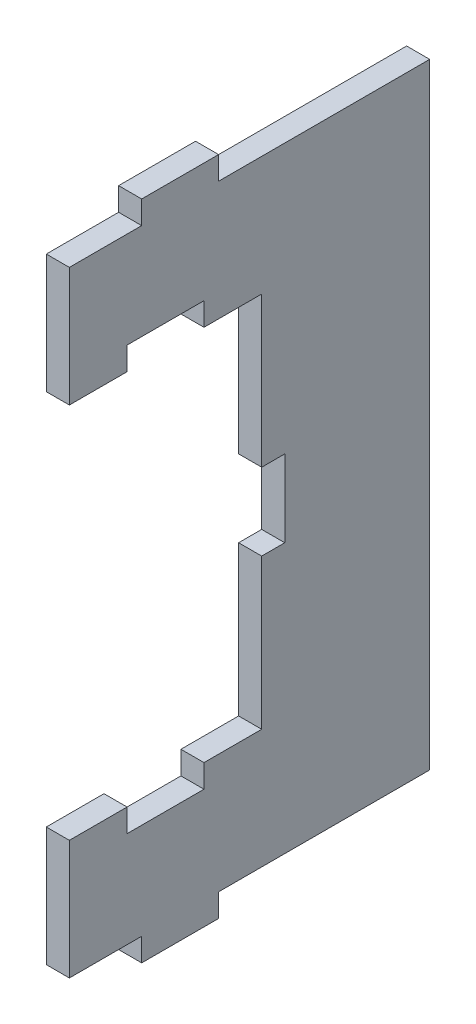
ISO-10303-21;
HEADER;
FILE_DESCRIPTION(('STEP AP214'),'2;1');
FILE_NAME('part.step','',(''),(''),'','','');
FILE_SCHEMA(('AUTOMOTIVE_DESIGN { 1 0 10303 214 1 1 1 1 }'));
ENDSEC;
DATA;
#1=APPLICATION_CONTEXT('core data for automotive mechanical design processes');
#2=APPLICATION_PROTOCOL_DEFINITION('international standard','automotive_design',2000,#1);
#3=PRODUCT_CONTEXT('',#1,'mechanical');
#4=PRODUCT('Part','Part','',(#3));
#5=PRODUCT_RELATED_PRODUCT_CATEGORY('part','',(#4));
#6=PRODUCT_DEFINITION_FORMATION('','',#4);
#7=PRODUCT_DEFINITION_CONTEXT('part definition',#1,'design');
#8=PRODUCT_DEFINITION('design','',#6,#7);
#9=PRODUCT_DEFINITION_SHAPE('','',#8);
#10=(LENGTH_UNIT() NAMED_UNIT(*) SI_UNIT(.MILLI.,.METRE.));
#11=(NAMED_UNIT(*) PLANE_ANGLE_UNIT() SI_UNIT($,.RADIAN.));
#12=(NAMED_UNIT(*) SI_UNIT($,.STERADIAN.) SOLID_ANGLE_UNIT());
#13=UNCERTAINTY_MEASURE_WITH_UNIT(LENGTH_MEASURE(1.E-05),#10,'distance_accuracy_value','');
#14=(GEOMETRIC_REPRESENTATION_CONTEXT(3) GLOBAL_UNCERTAINTY_ASSIGNED_CONTEXT((#13)) GLOBAL_UNIT_ASSIGNED_CONTEXT((#10,
#11,#12)) REPRESENTATION_CONTEXT('',''));
#15=CARTESIAN_POINT('',(0.,0.,0.));
#16=DIRECTION('',(0.,0.,1.));
#17=DIRECTION('',(1.,0.,0.));
#18=AXIS2_PLACEMENT_3D('',#15,#16,#17);
#19=CARTESIAN_POINT('',(3.,24.5,39.3399999999991));
#20=DIRECTION('',(0.,-1.,0.));
#21=DIRECTION('',(0.,0.,-1.));
#22=AXIS2_PLACEMENT_3D('',#19,#20,#21);
#23=PLANE('',#22);
#24=DIRECTION('',(0.,0.,1.));
#25=VECTOR('',#24,1.);
#26=CARTESIAN_POINT('',(0.,24.5,39.3399999999991));
#27=LINE('',#26,#25);
#28=CARTESIAN_POINT('',(0.,24.5,39.3399999999991));
#29=VERTEX_POINT('',#28);
#30=CARTESIAN_POINT('',(0.,24.5,46.84));
#31=VERTEX_POINT('',#30);
#32=EDGE_CURVE('E241',#29,#31,#27,.T.);
#33=ORIENTED_EDGE('',*,*,#32,.F.);
#34=DIRECTION('',(-1.,0.,0.));
#35=VECTOR('',#34,1.);
#36=CARTESIAN_POINT('',(3.,24.5,39.3399999999991));
#37=LINE('',#36,#35);
#38=CARTESIAN_POINT('',(3.,24.5,39.3399999999991));
#39=VERTEX_POINT('',#38);
#40=EDGE_CURVE('E32',#39,#29,#37,.T.);
#41=ORIENTED_EDGE('',*,*,#40,.F.);
#42=DIRECTION('',(0.,0.,1.));
#43=VECTOR('',#42,1.);
#44=CARTESIAN_POINT('',(3.,24.5,39.3399999999991));
#45=LINE('',#44,#43);
#46=CARTESIAN_POINT('',(3.,24.5,46.84));
#47=VERTEX_POINT('',#46);
#48=EDGE_CURVE('E232',#39,#47,#45,.T.);
#49=ORIENTED_EDGE('',*,*,#48,.T.);
#50=DIRECTION('',(-1.,0.,0.));
#51=VECTOR('',#50,1.);
#52=CARTESIAN_POINT('',(3.,24.5,46.84));
#53=LINE('',#52,#51);
#54=EDGE_CURVE('E10',#47,#31,#53,.T.);
#55=ORIENTED_EDGE('',*,*,#54,.T.);
#56=EDGE_LOOP('',(#33,#41,#49,#55));
#57=FACE_BOUND('',#56,.T.);
#58=ADVANCED_FACE('F16',(#57),#23,.T.);
#59=CARTESIAN_POINT('',(3.,24.5,46.84));
#60=DIRECTION('',(0.,0.,1.));
#61=DIRECTION('',(0.,-1.,0.));
#62=AXIS2_PLACEMENT_3D('',#59,#60,#61);
#63=PLANE('',#62);
#64=DIRECTION('',(0.,1.,0.));
#65=VECTOR('',#64,1.);
#66=CARTESIAN_POINT('',(0.,24.5,46.84));
#67=LINE('',#66,#65);
#68=CARTESIAN_POINT('',(0.,40.,46.84));
#69=VERTEX_POINT('',#68);
#70=EDGE_CURVE('E236',#31,#69,#67,.T.);
#71=ORIENTED_EDGE('',*,*,#70,.F.);
#72=ORIENTED_EDGE('',*,*,#54,.F.);
#73=DIRECTION('',(0.,1.,0.));
#74=VECTOR('',#73,1.);
#75=CARTESIAN_POINT('',(3.,24.5,46.84));
#76=LINE('',#75,#74);
#77=CARTESIAN_POINT('',(3.,40.,46.84));
#78=VERTEX_POINT('',#77);
#79=EDGE_CURVE('E234',#47,#78,#76,.T.);
#80=ORIENTED_EDGE('',*,*,#79,.T.);
#81=DIRECTION('',(-1.,0.,0.));
#82=VECTOR('',#81,1.);
#83=CARTESIAN_POINT('',(3.,40.,46.84));
#84=LINE('',#83,#82);
#85=EDGE_CURVE('E24',#78,#69,#84,.T.);
#86=ORIENTED_EDGE('',*,*,#85,.T.);
#87=EDGE_LOOP('',(#71,#72,#80,#86));
#88=FACE_BOUND('',#87,.T.);
#89=ADVANCED_FACE('F390',(#88),#63,.T.);
#90=CARTESIAN_POINT('',(3.,40.,46.84));
#91=DIRECTION('',(0.,1.,0.));
#92=DIRECTION('',(0.,0.,1.));
#93=AXIS2_PLACEMENT_3D('',#90,#91,#92);
#94=PLANE('',#93);
#95=DIRECTION('',(0.,0.,-1.));
#96=VECTOR('',#95,1.);
#97=CARTESIAN_POINT('',(0.,40.,46.84));
#98=LINE('',#97,#96);
#99=CARTESIAN_POINT('',(0.,40.,37.44));
#100=VERTEX_POINT('',#99);
#101=EDGE_CURVE('E240',#69,#100,#98,.T.);
#102=ORIENTED_EDGE('',*,*,#101,.F.);
#103=ORIENTED_EDGE('',*,*,#85,.F.);
#104=DIRECTION('',(0.,0.,-1.));
#105=VECTOR('',#104,1.);
#106=CARTESIAN_POINT('',(3.,40.,46.84));
#107=LINE('',#106,#105);
#108=CARTESIAN_POINT('',(3.,40.,37.44));
#109=VERTEX_POINT('',#108);
#110=EDGE_CURVE('E399',#78,#109,#107,.T.);
#111=ORIENTED_EDGE('',*,*,#110,.T.);
#112=DIRECTION('',(-1.,0.,0.));
#113=VECTOR('',#112,1.);
#114=CARTESIAN_POINT('',(3.,40.,37.44));
#115=LINE('',#114,#113);
#116=EDGE_CURVE('E388',#109,#100,#115,.T.);
#117=ORIENTED_EDGE('',*,*,#116,.T.);
#118=EDGE_LOOP('',(#102,#103,#111,#117));
#119=FACE_BOUND('',#118,.T.);
#120=ADVANCED_FACE('F394',(#119),#94,.T.);
#121=CARTESIAN_POINT('',(3.,40.,37.44));
#122=DIRECTION('',(0.,0.,1.));
#123=DIRECTION('',(0.,-1.,0.));
#124=AXIS2_PLACEMENT_3D('',#121,#122,#123);
#125=PLANE('',#124);
#126=DIRECTION('',(0.,1.,0.));
#127=VECTOR('',#126,1.);
#128=CARTESIAN_POINT('',(0.,40.,37.44));
#129=LINE('',#128,#127);
#130=CARTESIAN_POINT('',(0.,43.,37.44));
#131=VERTEX_POINT('',#130);
#132=EDGE_CURVE('E245',#100,#131,#129,.T.);
#133=ORIENTED_EDGE('',*,*,#132,.F.);
#134=ORIENTED_EDGE('',*,*,#116,.F.);
#135=DIRECTION('',(0.,1.,0.));
#136=VECTOR('',#135,1.);
#137=CARTESIAN_POINT('',(3.,40.,37.44));
#138=LINE('',#137,#136);
#139=CARTESIAN_POINT('',(3.,43.,37.44));
#140=VERTEX_POINT('',#139);
#141=EDGE_CURVE('E401',#109,#140,#138,.T.);
#142=ORIENTED_EDGE('',*,*,#141,.T.);
#143=DIRECTION('',(-1.,0.,0.));
#144=VECTOR('',#143,1.);
#145=CARTESIAN_POINT('',(3.,43.,37.44));
#146=LINE('',#145,#144);
#147=EDGE_CURVE('E386',#140,#131,#146,.T.);
#148=ORIENTED_EDGE('',*,*,#147,.T.);
#149=EDGE_LOOP('',(#133,#134,#142,#148));
#150=FACE_BOUND('',#149,.T.);
#151=ADVANCED_FACE('F549',(#150),#125,.T.);
#152=CARTESIAN_POINT('',(3.,43.,37.44));
#153=DIRECTION('',(0.,1.,0.));
#154=DIRECTION('',(0.,0.,1.));
#155=AXIS2_PLACEMENT_3D('',#152,#153,#154);
#156=PLANE('',#155);
#157=DIRECTION('',(0.,0.,-1.));
#158=VECTOR('',#157,1.);
#159=CARTESIAN_POINT('',(0.,43.,37.44));
#160=LINE('',#159,#158);
#161=CARTESIAN_POINT('',(0.,43.,27.44));
#162=VERTEX_POINT('',#161);
#163=EDGE_CURVE('E249',#131,#162,#160,.T.);
#164=ORIENTED_EDGE('',*,*,#163,.F.);
#165=ORIENTED_EDGE('',*,*,#147,.F.);
#166=DIRECTION('',(0.,0.,-1.));
#167=VECTOR('',#166,1.);
#168=CARTESIAN_POINT('',(3.,43.,37.44));
#169=LINE('',#168,#167);
#170=CARTESIAN_POINT('',(3.,43.,27.44));
#171=VERTEX_POINT('',#170);
#172=EDGE_CURVE('E406',#140,#171,#169,.T.);
#173=ORIENTED_EDGE('',*,*,#172,.T.);
#174=DIRECTION('',(-1.,0.,0.));
#175=VECTOR('',#174,1.);
#176=CARTESIAN_POINT('',(3.,43.,27.44));
#177=LINE('',#176,#175);
#178=EDGE_CURVE('E384',#171,#162,#177,.T.);
#179=ORIENTED_EDGE('',*,*,#178,.T.);
#180=EDGE_LOOP('',(#164,#165,#173,#179));
#181=FACE_BOUND('',#180,.T.);
#182=ADVANCED_FACE('F547',(#181),#156,.T.);
#183=CARTESIAN_POINT('',(3.,43.,27.44));
#184=DIRECTION('',(0.,0.,-1.));
#185=DIRECTION('',(0.,1.,0.));
#186=AXIS2_PLACEMENT_3D('',#183,#184,#185);
#187=PLANE('',#186);
#188=DIRECTION('',(0.,-1.,0.));
#189=VECTOR('',#188,1.);
#190=CARTESIAN_POINT('',(0.,43.,27.44));
#191=LINE('',#190,#189);
#192=CARTESIAN_POINT('',(0.,40.,27.44));
#193=VERTEX_POINT('',#192);
#194=EDGE_CURVE('E253',#162,#193,#191,.T.);
#195=ORIENTED_EDGE('',*,*,#194,.F.);
#196=ORIENTED_EDGE('',*,*,#178,.F.);
#197=DIRECTION('',(0.,-1.,0.));
#198=VECTOR('',#197,1.);
#199=CARTESIAN_POINT('',(3.,43.,27.44));
#200=LINE('',#199,#198);
#201=CARTESIAN_POINT('',(3.,40.,27.44));
#202=VERTEX_POINT('',#201);
#203=EDGE_CURVE('E409',#171,#202,#200,.T.);
#204=ORIENTED_EDGE('',*,*,#203,.T.);
#205=DIRECTION('',(-1.,0.,0.));
#206=VECTOR('',#205,1.);
#207=CARTESIAN_POINT('',(3.,40.,27.44));
#208=LINE('',#207,#206);
#209=EDGE_CURVE('E382',#202,#193,#208,.T.);
#210=ORIENTED_EDGE('',*,*,#209,.T.);
#211=EDGE_LOOP('',(#195,#196,#204,#210));
#212=FACE_BOUND('',#211,.T.);
#213=ADVANCED_FACE('F544',(#212),#187,.T.);
#214=CARTESIAN_POINT('',(3.,40.,27.44));
#215=DIRECTION('',(0.,1.,0.));
#216=DIRECTION('',(0.,0.,1.));
#217=AXIS2_PLACEMENT_3D('',#214,#215,#216);
#218=PLANE('',#217);
#219=DIRECTION('',(0.,0.,-1.));
#220=VECTOR('',#219,1.);
#221=CARTESIAN_POINT('',(0.,40.,27.44));
#222=LINE('',#221,#220);
#223=CARTESIAN_POINT('',(0.,40.,0.));
#224=VERTEX_POINT('',#223);
#225=EDGE_CURVE('E257',#193,#224,#222,.T.);
#226=ORIENTED_EDGE('',*,*,#225,.F.);
#227=ORIENTED_EDGE('',*,*,#209,.F.);
#228=DIRECTION('',(0.,0.,-1.));
#229=VECTOR('',#228,1.);
#230=CARTESIAN_POINT('',(3.,40.,27.44));
#231=LINE('',#230,#229);
#232=CARTESIAN_POINT('',(3.,40.,0.));
#233=VERTEX_POINT('',#232);
#234=EDGE_CURVE('E412',#202,#233,#231,.T.);
#235=ORIENTED_EDGE('',*,*,#234,.T.);
#236=DIRECTION('',(-1.,0.,0.));
#237=VECTOR('',#236,1.);
#238=CARTESIAN_POINT('',(3.,40.,0.));
#239=LINE('',#238,#237);
#240=EDGE_CURVE('E380',#233,#224,#239,.T.);
#241=ORIENTED_EDGE('',*,*,#240,.T.);
#242=EDGE_LOOP('',(#226,#227,#235,#241));
#243=FACE_BOUND('',#242,.T.);
#244=ADVANCED_FACE('F539',(#243),#218,.T.);
#245=CARTESIAN_POINT('',(3.,40.,0.));
#246=DIRECTION('',(0.,0.,-1.));
#247=DIRECTION('',(-1.,0.,0.));
#248=AXIS2_PLACEMENT_3D('',#245,#246,#247);
#249=PLANE('',#248);
#250=DIRECTION('',(0.,-1.,0.));
#251=VECTOR('',#250,1.);
#252=CARTESIAN_POINT('',(0.,40.,0.));
#253=LINE('',#252,#251);
#254=CARTESIAN_POINT('',(0.,-40.,0.));
#255=VERTEX_POINT('',#254);
#256=EDGE_CURVE('E261',#224,#255,#253,.T.);
#257=ORIENTED_EDGE('',*,*,#256,.F.);
#258=ORIENTED_EDGE('',*,*,#240,.F.);
#259=DIRECTION('',(0.,-1.,0.));
#260=VECTOR('',#259,1.);
#261=CARTESIAN_POINT('',(3.,40.,0.));
#262=LINE('',#261,#260);
#263=CARTESIAN_POINT('',(3.,-40.,0.));
#264=VERTEX_POINT('',#263);
#265=EDGE_CURVE('E415',#233,#264,#262,.T.);
#266=ORIENTED_EDGE('',*,*,#265,.T.);
#267=DIRECTION('',(-1.,0.,0.));
#268=VECTOR('',#267,1.);
#269=CARTESIAN_POINT('',(3.,-40.,0.));
#270=LINE('',#269,#268);
#271=EDGE_CURVE('E378',#264,#255,#270,.T.);
#272=ORIENTED_EDGE('',*,*,#271,.T.);
#273=EDGE_LOOP('',(#257,#258,#266,#272));
#274=FACE_BOUND('',#273,.T.);
#275=ADVANCED_FACE('F536',(#274),#249,.T.);
#276=CARTESIAN_POINT('',(3.,-40.,0.));
#277=DIRECTION('',(0.,-1.,0.));
#278=DIRECTION('',(0.,0.,-1.));
#279=AXIS2_PLACEMENT_3D('',#276,#277,#278);
#280=PLANE('',#279);
#281=DIRECTION('',(0.,0.,1.));
#282=VECTOR('',#281,1.);
#283=CARTESIAN_POINT('',(0.,-40.,0.));
#284=LINE('',#283,#282);
#285=CARTESIAN_POINT('',(0.,-40.,27.44));
#286=VERTEX_POINT('',#285);
#287=EDGE_CURVE('E265',#255,#286,#284,.T.);
#288=ORIENTED_EDGE('',*,*,#287,.F.);
#289=ORIENTED_EDGE('',*,*,#271,.F.);
#290=DIRECTION('',(0.,0.,1.));
#291=VECTOR('',#290,1.);
#292=CARTESIAN_POINT('',(3.,-40.,0.));
#293=LINE('',#292,#291);
#294=CARTESIAN_POINT('',(3.,-40.,27.44));
#295=VERTEX_POINT('',#294);
#296=EDGE_CURVE('E418',#264,#295,#293,.T.);
#297=ORIENTED_EDGE('',*,*,#296,.T.);
#298=DIRECTION('',(-1.,0.,0.));
#299=VECTOR('',#298,1.);
#300=CARTESIAN_POINT('',(3.,-40.,27.44));
#301=LINE('',#300,#299);
#302=EDGE_CURVE('E376',#295,#286,#301,.T.);
#303=ORIENTED_EDGE('',*,*,#302,.T.);
#304=EDGE_LOOP('',(#288,#289,#297,#303));
#305=FACE_BOUND('',#304,.T.);
#306=ADVANCED_FACE('F533',(#305),#280,.T.);
#307=CARTESIAN_POINT('',(3.,-40.,27.44));
#308=DIRECTION('',(0.,0.,-1.));
#309=DIRECTION('',(0.,1.,0.));
#310=AXIS2_PLACEMENT_3D('',#307,#308,#309);
#311=PLANE('',#310);
#312=DIRECTION('',(0.,-1.,0.));
#313=VECTOR('',#312,1.);
#314=CARTESIAN_POINT('',(0.,-40.,27.44));
#315=LINE('',#314,#313);
#316=CARTESIAN_POINT('',(0.,-43.,27.44));
#317=VERTEX_POINT('',#316);
#318=EDGE_CURVE('E269',#286,#317,#315,.T.);
#319=ORIENTED_EDGE('',*,*,#318,.F.);
#320=ORIENTED_EDGE('',*,*,#302,.F.);
#321=DIRECTION('',(0.,-1.,0.));
#322=VECTOR('',#321,1.);
#323=CARTESIAN_POINT('',(3.,-40.,27.44));
#324=LINE('',#323,#322);
#325=CARTESIAN_POINT('',(3.,-43.,27.44));
#326=VERTEX_POINT('',#325);
#327=EDGE_CURVE('E421',#295,#326,#324,.T.);
#328=ORIENTED_EDGE('',*,*,#327,.T.);
#329=DIRECTION('',(-1.,0.,0.));
#330=VECTOR('',#329,1.);
#331=CARTESIAN_POINT('',(3.,-43.,27.44));
#332=LINE('',#331,#330);
#333=EDGE_CURVE('E374',#326,#317,#332,.T.);
#334=ORIENTED_EDGE('',*,*,#333,.T.);
#335=EDGE_LOOP('',(#319,#320,#328,#334));
#336=FACE_BOUND('',#335,.T.);
#337=ADVANCED_FACE('F527',(#336),#311,.T.);
#338=CARTESIAN_POINT('',(3.,-43.,27.44));
#339=DIRECTION('',(0.,-1.,0.));
#340=DIRECTION('',(0.,0.,-1.));
#341=AXIS2_PLACEMENT_3D('',#338,#339,#340);
#342=PLANE('',#341);
#343=DIRECTION('',(0.,0.,1.));
#344=VECTOR('',#343,1.);
#345=CARTESIAN_POINT('',(0.,-43.,27.44));
#346=LINE('',#345,#344);
#347=CARTESIAN_POINT('',(0.,-43.,37.44));
#348=VERTEX_POINT('',#347);
#349=EDGE_CURVE('E273',#317,#348,#346,.T.);
#350=ORIENTED_EDGE('',*,*,#349,.F.);
#351=ORIENTED_EDGE('',*,*,#333,.F.);
#352=DIRECTION('',(0.,0.,1.));
#353=VECTOR('',#352,1.);
#354=CARTESIAN_POINT('',(3.,-43.,27.44));
#355=LINE('',#354,#353);
#356=CARTESIAN_POINT('',(3.,-43.,37.44));
#357=VERTEX_POINT('',#356);
#358=EDGE_CURVE('E424',#326,#357,#355,.T.);
#359=ORIENTED_EDGE('',*,*,#358,.T.);
#360=DIRECTION('',(-1.,0.,0.));
#361=VECTOR('',#360,1.);
#362=CARTESIAN_POINT('',(3.,-43.,37.44));
#363=LINE('',#362,#361);
#364=EDGE_CURVE('E372',#357,#348,#363,.T.);
#365=ORIENTED_EDGE('',*,*,#364,.T.);
#366=EDGE_LOOP('',(#350,#351,#359,#365));
#367=FACE_BOUND('',#366,.T.);
#368=ADVANCED_FACE('F524',(#367),#342,.T.);
#369=CARTESIAN_POINT('',(3.,-43.,37.44));
#370=DIRECTION('',(0.,0.,1.));
#371=DIRECTION('',(1.,0.,0.));
#372=AXIS2_PLACEMENT_3D('',#369,#370,#371);
#373=PLANE('',#372);
#374=DIRECTION('',(0.,1.,0.));
#375=VECTOR('',#374,1.);
#376=CARTESIAN_POINT('',(0.,-43.,37.44));
#377=LINE('',#376,#375);
#378=CARTESIAN_POINT('',(0.,-40.,37.44));
#379=VERTEX_POINT('',#378);
#380=EDGE_CURVE('E277',#348,#379,#377,.T.);
#381=ORIENTED_EDGE('',*,*,#380,.F.);
#382=ORIENTED_EDGE('',*,*,#364,.F.);
#383=DIRECTION('',(0.,1.,0.));
#384=VECTOR('',#383,1.);
#385=CARTESIAN_POINT('',(3.,-43.,37.44));
#386=LINE('',#385,#384);
#387=CARTESIAN_POINT('',(3.,-40.,37.44));
#388=VERTEX_POINT('',#387);
#389=EDGE_CURVE('E427',#357,#388,#386,.T.);
#390=ORIENTED_EDGE('',*,*,#389,.T.);
#391=DIRECTION('',(-1.,0.,0.));
#392=VECTOR('',#391,1.);
#393=CARTESIAN_POINT('',(3.,-40.,37.44));
#394=LINE('',#393,#392);
#395=EDGE_CURVE('E370',#388,#379,#394,.T.);
#396=ORIENTED_EDGE('',*,*,#395,.T.);
#397=EDGE_LOOP('',(#381,#382,#390,#396));
#398=FACE_BOUND('',#397,.T.);
#399=ADVANCED_FACE('F521',(#398),#373,.T.);
#400=CARTESIAN_POINT('',(3.,-40.,37.44));
#401=DIRECTION('',(0.,-1.,0.));
#402=DIRECTION('',(0.,0.,-1.));
#403=AXIS2_PLACEMENT_3D('',#400,#401,#402);
#404=PLANE('',#403);
#405=DIRECTION('',(0.,0.,1.));
#406=VECTOR('',#405,1.);
#407=CARTESIAN_POINT('',(0.,-40.,37.44));
#408=LINE('',#407,#406);
#409=CARTESIAN_POINT('',(0.,-40.,46.84));
#410=VERTEX_POINT('',#409);
#411=EDGE_CURVE('E281',#379,#410,#408,.T.);
#412=ORIENTED_EDGE('',*,*,#411,.F.);
#413=ORIENTED_EDGE('',*,*,#395,.F.);
#414=DIRECTION('',(0.,0.,1.));
#415=VECTOR('',#414,1.);
#416=CARTESIAN_POINT('',(3.,-40.,37.44));
#417=LINE('',#416,#415);
#418=CARTESIAN_POINT('',(3.,-40.,46.84));
#419=VERTEX_POINT('',#418);
#420=EDGE_CURVE('E430',#388,#419,#417,.T.);
#421=ORIENTED_EDGE('',*,*,#420,.T.);
#422=DIRECTION('',(-1.,0.,0.));
#423=VECTOR('',#422,1.);
#424=CARTESIAN_POINT('',(3.,-40.,46.84));
#425=LINE('',#424,#423);
#426=EDGE_CURVE('E368',#419,#410,#425,.T.);
#427=ORIENTED_EDGE('',*,*,#426,.T.);
#428=EDGE_LOOP('',(#412,#413,#421,#427));
#429=FACE_BOUND('',#428,.T.);
#430=ADVANCED_FACE('F515',(#429),#404,.T.);
#431=CARTESIAN_POINT('',(3.,-40.,46.84));
#432=DIRECTION('',(0.,0.,1.));
#433=DIRECTION('',(0.,-1.,0.));
#434=AXIS2_PLACEMENT_3D('',#431,#432,#433);
#435=PLANE('',#434);
#436=DIRECTION('',(0.,1.,0.));
#437=VECTOR('',#436,1.);
#438=CARTESIAN_POINT('',(0.,-40.,46.84));
#439=LINE('',#438,#437);
#440=CARTESIAN_POINT('',(0.,-24.5,46.84));
#441=VERTEX_POINT('',#440);
#442=EDGE_CURVE('E285',#410,#441,#439,.T.);
#443=ORIENTED_EDGE('',*,*,#442,.F.);
#444=ORIENTED_EDGE('',*,*,#426,.F.);
#445=DIRECTION('',(0.,1.,0.));
#446=VECTOR('',#445,1.);
#447=CARTESIAN_POINT('',(3.,-40.,46.84));
#448=LINE('',#447,#446);
#449=CARTESIAN_POINT('',(3.,-24.5,46.84));
#450=VERTEX_POINT('',#449);
#451=EDGE_CURVE('E433',#419,#450,#448,.T.);
#452=ORIENTED_EDGE('',*,*,#451,.T.);
#453=DIRECTION('',(-1.,0.,0.));
#454=VECTOR('',#453,1.);
#455=CARTESIAN_POINT('',(3.,-24.5,46.84));
#456=LINE('',#455,#454);
#457=EDGE_CURVE('E366',#450,#441,#456,.T.);
#458=ORIENTED_EDGE('',*,*,#457,.T.);
#459=EDGE_LOOP('',(#443,#444,#452,#458));
#460=FACE_BOUND('',#459,.T.);
#461=ADVANCED_FACE('F512',(#460),#435,.T.);
#462=CARTESIAN_POINT('',(3.,-24.5,46.84));
#463=DIRECTION('',(0.,1.,0.));
#464=DIRECTION('',(0.,0.,1.));
#465=AXIS2_PLACEMENT_3D('',#462,#463,#464);
#466=PLANE('',#465);
#467=DIRECTION('',(0.,0.,-1.));
#468=VECTOR('',#467,1.);
#469=CARTESIAN_POINT('',(0.,-24.5,46.84));
#470=LINE('',#469,#468);
#471=CARTESIAN_POINT('',(0.,-24.5,39.3399999999991));
#472=VERTEX_POINT('',#471);
#473=EDGE_CURVE('E289',#441,#472,#470,.T.);
#474=ORIENTED_EDGE('',*,*,#473,.F.);
#475=ORIENTED_EDGE('',*,*,#457,.F.);
#476=DIRECTION('',(0.,0.,-1.));
#477=VECTOR('',#476,1.);
#478=CARTESIAN_POINT('',(3.,-24.5,46.84));
#479=LINE('',#478,#477);
#480=CARTESIAN_POINT('',(3.,-24.5,39.3399999999991));
#481=VERTEX_POINT('',#480);
#482=EDGE_CURVE('E436',#450,#481,#479,.T.);
#483=ORIENTED_EDGE('',*,*,#482,.T.);
#484=DIRECTION('',(-1.,0.,0.));
#485=VECTOR('',#484,1.);
#486=CARTESIAN_POINT('',(3.,-24.5,39.3399999999991));
#487=LINE('',#486,#485);
#488=EDGE_CURVE('E364',#481,#472,#487,.T.);
#489=ORIENTED_EDGE('',*,*,#488,.T.);
#490=EDGE_LOOP('',(#474,#475,#483,#489));
#491=FACE_BOUND('',#490,.T.);
#492=ADVANCED_FACE('F509',(#491),#466,.T.);
#493=CARTESIAN_POINT('',(3.,-24.5,39.3399999999991));
#494=DIRECTION('',(0.,0.,-1.));
#495=DIRECTION('',(0.,1.,0.));
#496=AXIS2_PLACEMENT_3D('',#493,#494,#495);
#497=PLANE('',#496);
#498=DIRECTION('',(0.,-1.,0.));
#499=VECTOR('',#498,1.);
#500=CARTESIAN_POINT('',(0.,-24.5,39.3399999999991));
#501=LINE('',#500,#499);
#502=CARTESIAN_POINT('',(0.,-27.5,39.3399999999991));
#503=VERTEX_POINT('',#502);
#504=EDGE_CURVE('E293',#472,#503,#501,.T.);
#505=ORIENTED_EDGE('',*,*,#504,.F.);
#506=ORIENTED_EDGE('',*,*,#488,.F.);
#507=DIRECTION('',(0.,-1.,0.));
#508=VECTOR('',#507,1.);
#509=CARTESIAN_POINT('',(3.,-24.5,39.3399999999991));
#510=LINE('',#509,#508);
#511=CARTESIAN_POINT('',(3.,-27.5,39.3399999999991));
#512=VERTEX_POINT('',#511);
#513=EDGE_CURVE('E439',#481,#512,#510,.T.);
#514=ORIENTED_EDGE('',*,*,#513,.T.);
#515=DIRECTION('',(-1.,0.,0.));
#516=VECTOR('',#515,1.);
#517=CARTESIAN_POINT('',(3.,-27.5,39.3399999999991));
#518=LINE('',#517,#516);
#519=EDGE_CURVE('E362',#512,#503,#518,.T.);
#520=ORIENTED_EDGE('',*,*,#519,.T.);
#521=EDGE_LOOP('',(#505,#506,#514,#520));
#522=FACE_BOUND('',#521,.T.);
#523=ADVANCED_FACE('F503',(#522),#497,.T.);
#524=CARTESIAN_POINT('',(3.,-27.5,39.3399999999991));
#525=DIRECTION('',(0.,1.,0.));
#526=DIRECTION('',(0.,0.,1.));
#527=AXIS2_PLACEMENT_3D('',#524,#525,#526);
#528=PLANE('',#527);
#529=DIRECTION('',(0.,0.,-1.));
#530=VECTOR('',#529,1.);
#531=CARTESIAN_POINT('',(0.,-27.5,39.3399999999991));
#532=LINE('',#531,#530);
#533=CARTESIAN_POINT('',(0.,-27.5,29.34));
#534=VERTEX_POINT('',#533);
#535=EDGE_CURVE('E297',#503,#534,#532,.T.);
#536=ORIENTED_EDGE('',*,*,#535,.F.);
#537=ORIENTED_EDGE('',*,*,#519,.F.);
#538=DIRECTION('',(0.,0.,-1.));
#539=VECTOR('',#538,1.);
#540=CARTESIAN_POINT('',(3.,-27.5,39.3399999999991));
#541=LINE('',#540,#539);
#542=CARTESIAN_POINT('',(3.,-27.5,29.34));
#543=VERTEX_POINT('',#542);
#544=EDGE_CURVE('E442',#512,#543,#541,.T.);
#545=ORIENTED_EDGE('',*,*,#544,.T.);
#546=DIRECTION('',(-1.,0.,0.));
#547=VECTOR('',#546,1.);
#548=CARTESIAN_POINT('',(3.,-27.5,29.34));
#549=LINE('',#548,#547);
#550=EDGE_CURVE('E360',#543,#534,#549,.T.);
#551=ORIENTED_EDGE('',*,*,#550,.T.);
#552=EDGE_LOOP('',(#536,#537,#545,#551));
#553=FACE_BOUND('',#552,.T.);
#554=ADVANCED_FACE('F500',(#553),#528,.T.);
#555=CARTESIAN_POINT('',(3.,-27.5,29.34));
#556=DIRECTION('',(0.,0.,1.));
#557=DIRECTION('',(0.,-1.,0.));
#558=AXIS2_PLACEMENT_3D('',#555,#556,#557);
#559=PLANE('',#558);
#560=DIRECTION('',(0.,1.,0.));
#561=VECTOR('',#560,1.);
#562=CARTESIAN_POINT('',(0.,-27.5,29.34));
#563=LINE('',#562,#561);
#564=CARTESIAN_POINT('',(0.,-24.5,29.34));
#565=VERTEX_POINT('',#564);
#566=EDGE_CURVE('E301',#534,#565,#563,.T.);
#567=ORIENTED_EDGE('',*,*,#566,.F.);
#568=ORIENTED_EDGE('',*,*,#550,.F.);
#569=DIRECTION('',(0.,1.,0.));
#570=VECTOR('',#569,1.);
#571=CARTESIAN_POINT('',(3.,-27.5,29.34));
#572=LINE('',#571,#570);
#573=CARTESIAN_POINT('',(3.,-24.5,29.34));
#574=VERTEX_POINT('',#573);
#575=EDGE_CURVE('E445',#543,#574,#572,.T.);
#576=ORIENTED_EDGE('',*,*,#575,.T.);
#577=DIRECTION('',(-1.,0.,0.));
#578=VECTOR('',#577,1.);
#579=CARTESIAN_POINT('',(3.,-24.5,29.34));
#580=LINE('',#579,#578);
#581=EDGE_CURVE('E358',#574,#565,#580,.T.);
#582=ORIENTED_EDGE('',*,*,#581,.T.);
#583=EDGE_LOOP('',(#567,#568,#576,#582));
#584=FACE_BOUND('',#583,.T.);
#585=ADVANCED_FACE('F497',(#584),#559,.T.);
#586=CARTESIAN_POINT('',(3.,-24.5,29.34));
#587=DIRECTION('',(0.,1.,0.));
#588=DIRECTION('',(0.,0.,1.));
#589=AXIS2_PLACEMENT_3D('',#586,#587,#588);
#590=PLANE('',#589);
#591=DIRECTION('',(0.,0.,-1.));
#592=VECTOR('',#591,1.);
#593=CARTESIAN_POINT('',(0.,-24.5,29.34));
#594=LINE('',#593,#592);
#595=CARTESIAN_POINT('',(0.,-24.5,21.84));
#596=VERTEX_POINT('',#595);
#597=EDGE_CURVE('E305',#565,#596,#594,.T.);
#598=ORIENTED_EDGE('',*,*,#597,.F.);
#599=ORIENTED_EDGE('',*,*,#581,.F.);
#600=DIRECTION('',(0.,0.,-1.));
#601=VECTOR('',#600,1.);
#602=CARTESIAN_POINT('',(3.,-24.5,29.34));
#603=LINE('',#602,#601);
#604=CARTESIAN_POINT('',(3.,-24.5,21.84));
#605=VERTEX_POINT('',#604);
#606=EDGE_CURVE('E448',#574,#605,#603,.T.);
#607=ORIENTED_EDGE('',*,*,#606,.T.);
#608=DIRECTION('',(-1.,0.,0.));
#609=VECTOR('',#608,1.);
#610=CARTESIAN_POINT('',(3.,-24.5,21.84));
#611=LINE('',#610,#609);
#612=EDGE_CURVE('E356',#605,#596,#611,.T.);
#613=ORIENTED_EDGE('',*,*,#612,.T.);
#614=EDGE_LOOP('',(#598,#599,#607,#613));
#615=FACE_BOUND('',#614,.T.);
#616=ADVANCED_FACE('F491',(#615),#590,.T.);
#617=CARTESIAN_POINT('',(3.,-24.5,21.84));
#618=DIRECTION('',(0.,0.,1.));
#619=DIRECTION('',(1.,0.,0.));
#620=AXIS2_PLACEMENT_3D('',#617,#618,#619);
#621=PLANE('',#620);
#622=DIRECTION('',(0.,1.,0.));
#623=VECTOR('',#622,1.);
#624=CARTESIAN_POINT('',(0.,-24.5,21.84));
#625=LINE('',#624,#623);
#626=CARTESIAN_POINT('',(0.,-5.,21.84));
#627=VERTEX_POINT('',#626);
#628=EDGE_CURVE('E309',#596,#627,#625,.T.);
#629=ORIENTED_EDGE('',*,*,#628,.F.);
#630=ORIENTED_EDGE('',*,*,#612,.F.);
#631=DIRECTION('',(0.,1.,0.));
#632=VECTOR('',#631,1.);
#633=CARTESIAN_POINT('',(3.,-24.5,21.84));
#634=LINE('',#633,#632);
#635=CARTESIAN_POINT('',(3.,-5.,21.84));
#636=VERTEX_POINT('',#635);
#637=EDGE_CURVE('E451',#605,#636,#634,.T.);
#638=ORIENTED_EDGE('',*,*,#637,.T.);
#639=DIRECTION('',(-1.,0.,0.));
#640=VECTOR('',#639,1.);
#641=CARTESIAN_POINT('',(3.,-5.,21.84));
#642=LINE('',#641,#640);
#643=EDGE_CURVE('E354',#636,#627,#642,.T.);
#644=ORIENTED_EDGE('',*,*,#643,.T.);
#645=EDGE_LOOP('',(#629,#630,#638,#644));
#646=FACE_BOUND('',#645,.T.);
#647=ADVANCED_FACE('F488',(#646),#621,.T.);
#648=CARTESIAN_POINT('',(3.,-5.,21.84));
#649=DIRECTION('',(0.,1.,0.));
#650=DIRECTION('',(0.,0.,1.));
#651=AXIS2_PLACEMENT_3D('',#648,#649,#650);
#652=PLANE('',#651);
#653=DIRECTION('',(0.,0.,-1.));
#654=VECTOR('',#653,1.);
#655=CARTESIAN_POINT('',(0.,-5.,21.84));
#656=LINE('',#655,#654);
#657=CARTESIAN_POINT('',(0.,-5.,18.84));
#658=VERTEX_POINT('',#657);
#659=EDGE_CURVE('E313',#627,#658,#656,.T.);
#660=ORIENTED_EDGE('',*,*,#659,.F.);
#661=ORIENTED_EDGE('',*,*,#643,.F.);
#662=DIRECTION('',(0.,0.,-1.));
#663=VECTOR('',#662,1.);
#664=CARTESIAN_POINT('',(3.,-5.,21.84));
#665=LINE('',#664,#663);
#666=CARTESIAN_POINT('',(3.,-5.,18.84));
#667=VERTEX_POINT('',#666);
#668=EDGE_CURVE('E454',#636,#667,#665,.T.);
#669=ORIENTED_EDGE('',*,*,#668,.T.);
#670=DIRECTION('',(-1.,0.,0.));
#671=VECTOR('',#670,1.);
#672=CARTESIAN_POINT('',(3.,-5.,18.84));
#673=LINE('',#672,#671);
#674=EDGE_CURVE('E352',#667,#658,#673,.T.);
#675=ORIENTED_EDGE('',*,*,#674,.T.);
#676=EDGE_LOOP('',(#660,#661,#669,#675));
#677=FACE_BOUND('',#676,.T.);
#678=ADVANCED_FACE('F485',(#677),#652,.T.);
#679=CARTESIAN_POINT('',(3.,-5.,18.84));
#680=DIRECTION('',(0.,0.,1.));
#681=DIRECTION('',(1.,0.,0.));
#682=AXIS2_PLACEMENT_3D('',#679,#680,#681);
#683=PLANE('',#682);
#684=DIRECTION('',(0.,1.,0.));
#685=VECTOR('',#684,1.);
#686=CARTESIAN_POINT('',(0.,-5.,18.84));
#687=LINE('',#686,#685);
#688=CARTESIAN_POINT('',(0.,5.,18.84));
#689=VERTEX_POINT('',#688);
#690=EDGE_CURVE('E317',#658,#689,#687,.T.);
#691=ORIENTED_EDGE('',*,*,#690,.F.);
#692=ORIENTED_EDGE('',*,*,#674,.F.);
#693=DIRECTION('',(0.,1.,0.));
#694=VECTOR('',#693,1.);
#695=CARTESIAN_POINT('',(3.,-5.,18.84));
#696=LINE('',#695,#694);
#697=CARTESIAN_POINT('',(3.,5.,18.84));
#698=VERTEX_POINT('',#697);
#699=EDGE_CURVE('E457',#667,#698,#696,.T.);
#700=ORIENTED_EDGE('',*,*,#699,.T.);
#701=DIRECTION('',(-1.,0.,0.));
#702=VECTOR('',#701,1.);
#703=CARTESIAN_POINT('',(3.,5.,18.84));
#704=LINE('',#703,#702);
#705=EDGE_CURVE('E350',#698,#689,#704,.T.);
#706=ORIENTED_EDGE('',*,*,#705,.T.);
#707=EDGE_LOOP('',(#691,#692,#700,#706));
#708=FACE_BOUND('',#707,.T.);
#709=ADVANCED_FACE('F479',(#708),#683,.T.);
#710=CARTESIAN_POINT('',(3.,5.,18.84));
#711=DIRECTION('',(0.,-1.,0.));
#712=DIRECTION('',(0.,0.,-1.));
#713=AXIS2_PLACEMENT_3D('',#710,#711,#712);
#714=PLANE('',#713);
#715=DIRECTION('',(0.,0.,1.));
#716=VECTOR('',#715,1.);
#717=CARTESIAN_POINT('',(0.,5.,18.84));
#718=LINE('',#717,#716);
#719=CARTESIAN_POINT('',(0.,5.,21.84));
#720=VERTEX_POINT('',#719);
#721=EDGE_CURVE('E321',#689,#720,#718,.T.);
#722=ORIENTED_EDGE('',*,*,#721,.F.);
#723=ORIENTED_EDGE('',*,*,#705,.F.);
#724=DIRECTION('',(0.,0.,1.));
#725=VECTOR('',#724,1.);
#726=CARTESIAN_POINT('',(3.,5.,18.84));
#727=LINE('',#726,#725);
#728=CARTESIAN_POINT('',(3.,5.,21.84));
#729=VERTEX_POINT('',#728);
#730=EDGE_CURVE('E460',#698,#729,#727,.T.);
#731=ORIENTED_EDGE('',*,*,#730,.T.);
#732=DIRECTION('',(-1.,0.,0.));
#733=VECTOR('',#732,1.);
#734=CARTESIAN_POINT('',(3.,5.,21.84));
#735=LINE('',#734,#733);
#736=EDGE_CURVE('E348',#729,#720,#735,.T.);
#737=ORIENTED_EDGE('',*,*,#736,.T.);
#738=EDGE_LOOP('',(#722,#723,#731,#737));
#739=FACE_BOUND('',#738,.T.);
#740=ADVANCED_FACE('F476',(#739),#714,.T.);
#741=CARTESIAN_POINT('',(3.,5.,21.84));
#742=DIRECTION('',(0.,0.,1.));
#743=DIRECTION('',(0.,-1.,0.));
#744=AXIS2_PLACEMENT_3D('',#741,#742,#743);
#745=PLANE('',#744);
#746=DIRECTION('',(0.,1.,0.));
#747=VECTOR('',#746,1.);
#748=CARTESIAN_POINT('',(0.,5.,21.84));
#749=LINE('',#748,#747);
#750=CARTESIAN_POINT('',(0.,24.5,21.84));
#751=VERTEX_POINT('',#750);
#752=EDGE_CURVE('E325',#720,#751,#749,.T.);
#753=ORIENTED_EDGE('',*,*,#752,.F.);
#754=ORIENTED_EDGE('',*,*,#736,.F.);
#755=DIRECTION('',(0.,1.,0.));
#756=VECTOR('',#755,1.);
#757=CARTESIAN_POINT('',(3.,5.,21.84));
#758=LINE('',#757,#756);
#759=CARTESIAN_POINT('',(3.,24.5,21.84));
#760=VERTEX_POINT('',#759);
#761=EDGE_CURVE('E463',#729,#760,#758,.T.);
#762=ORIENTED_EDGE('',*,*,#761,.T.);
#763=DIRECTION('',(-1.,0.,0.));
#764=VECTOR('',#763,1.);
#765=CARTESIAN_POINT('',(3.,24.5,21.84));
#766=LINE('',#765,#764);
#767=EDGE_CURVE('E346',#760,#751,#766,.T.);
#768=ORIENTED_EDGE('',*,*,#767,.T.);
#769=EDGE_LOOP('',(#753,#754,#762,#768));
#770=FACE_BOUND('',#769,.T.);
#771=ADVANCED_FACE('F473',(#770),#745,.T.);
#772=CARTESIAN_POINT('',(3.,24.5,21.84));
#773=DIRECTION('',(0.,-1.,0.));
#774=DIRECTION('',(0.,0.,-1.));
#775=AXIS2_PLACEMENT_3D('',#772,#773,#774);
#776=PLANE('',#775);
#777=DIRECTION('',(0.,0.,1.));
#778=VECTOR('',#777,1.);
#779=CARTESIAN_POINT('',(0.,24.5,21.84));
#780=LINE('',#779,#778);
#781=CARTESIAN_POINT('',(0.,24.5,29.34));
#782=VERTEX_POINT('',#781);
#783=EDGE_CURVE('E329',#751,#782,#780,.T.);
#784=ORIENTED_EDGE('',*,*,#783,.F.);
#785=ORIENTED_EDGE('',*,*,#767,.F.);
#786=DIRECTION('',(0.,0.,1.));
#787=VECTOR('',#786,1.);
#788=CARTESIAN_POINT('',(3.,24.5,21.84));
#789=LINE('',#788,#787);
#790=CARTESIAN_POINT('',(3.,24.5,29.34));
#791=VERTEX_POINT('',#790);
#792=EDGE_CURVE('E223',#760,#791,#789,.T.);
#793=ORIENTED_EDGE('',*,*,#792,.T.);
#794=DIRECTION('',(-1.,0.,0.));
#795=VECTOR('',#794,1.);
#796=CARTESIAN_POINT('',(3.,24.5,29.34));
#797=LINE('',#796,#795);
#798=EDGE_CURVE('E215',#791,#782,#797,.T.);
#799=ORIENTED_EDGE('',*,*,#798,.T.);
#800=EDGE_LOOP('',(#784,#785,#793,#799));
#801=FACE_BOUND('',#800,.T.);
#802=ADVANCED_FACE('F467',(#801),#776,.T.);
#803=CARTESIAN_POINT('',(3.,24.5,29.34));
#804=DIRECTION('',(0.,0.,1.));
#805=DIRECTION('',(0.,-1.,0.));
#806=AXIS2_PLACEMENT_3D('',#803,#804,#805);
#807=PLANE('',#806);
#808=DIRECTION('',(0.,1.,0.));
#809=VECTOR('',#808,1.);
#810=CARTESIAN_POINT('',(0.,24.5,29.34));
#811=LINE('',#810,#809);
#812=CARTESIAN_POINT('',(0.,27.5,29.34));
#813=VERTEX_POINT('',#812);
#814=EDGE_CURVE('E333',#782,#813,#811,.T.);
#815=ORIENTED_EDGE('',*,*,#814,.F.);
#816=ORIENTED_EDGE('',*,*,#798,.F.);
#817=DIRECTION('',(0.,1.,0.));
#818=VECTOR('',#817,1.);
#819=CARTESIAN_POINT('',(3.,24.5,29.34));
#820=LINE('',#819,#818);
#821=CARTESIAN_POINT('',(3.,27.5,29.34));
#822=VERTEX_POINT('',#821);
#823=EDGE_CURVE('E218',#791,#822,#820,.T.);
#824=ORIENTED_EDGE('',*,*,#823,.T.);
#825=DIRECTION('',(-1.,0.,0.));
#826=VECTOR('',#825,1.);
#827=CARTESIAN_POINT('',(3.,27.5,29.34));
#828=LINE('',#827,#826);
#829=EDGE_CURVE('E204',#822,#813,#828,.T.);
#830=ORIENTED_EDGE('',*,*,#829,.T.);
#831=EDGE_LOOP('',(#815,#816,#824,#830));
#832=FACE_BOUND('',#831,.T.);
#833=ADVANCED_FACE('F219',(#832),#807,.T.);
#834=CARTESIAN_POINT('',(3.,27.5,29.34));
#835=DIRECTION('',(0.,-1.,0.));
#836=DIRECTION('',(0.,0.,-1.));
#837=AXIS2_PLACEMENT_3D('',#834,#835,#836);
#838=PLANE('',#837);
#839=DIRECTION('',(0.,0.,1.));
#840=VECTOR('',#839,1.);
#841=CARTESIAN_POINT('',(0.,27.5,29.34));
#842=LINE('',#841,#840);
#843=CARTESIAN_POINT('',(0.,27.5,39.3399999999991));
#844=VERTEX_POINT('',#843);
#845=EDGE_CURVE('E211',#813,#844,#842,.T.);
#846=ORIENTED_EDGE('',*,*,#845,.F.);
#847=ORIENTED_EDGE('',*,*,#829,.F.);
#848=DIRECTION('',(0.,0.,1.));
#849=VECTOR('',#848,1.);
#850=CARTESIAN_POINT('',(3.,27.5,29.34));
#851=LINE('',#850,#849);
#852=CARTESIAN_POINT('',(3.,27.5,39.3399999999991));
#853=VERTEX_POINT('',#852);
#854=EDGE_CURVE('E208',#822,#853,#851,.T.);
#855=ORIENTED_EDGE('',*,*,#854,.T.);
#856=DIRECTION('',(-1.,0.,0.));
#857=VECTOR('',#856,1.);
#858=CARTESIAN_POINT('',(3.,27.5,39.3399999999991));
#859=LINE('',#858,#857);
#860=EDGE_CURVE('E120',#853,#844,#859,.T.);
#861=ORIENTED_EDGE('',*,*,#860,.T.);
#862=EDGE_LOOP('',(#846,#847,#855,#861));
#863=FACE_BOUND('',#862,.T.);
#864=ADVANCED_FACE('F206',(#863),#838,.T.);
#865=CARTESIAN_POINT('',(3.,27.5,39.3399999999991));
#866=DIRECTION('',(0.,0.,-1.));
#867=DIRECTION('',(0.,1.,0.));
#868=AXIS2_PLACEMENT_3D('',#865,#866,#867);
#869=PLANE('',#868);
#870=DIRECTION('',(0.,-1.,0.));
#871=VECTOR('',#870,1.);
#872=CARTESIAN_POINT('',(0.,27.5,39.3399999999991));
#873=LINE('',#872,#871);
#874=EDGE_CURVE('E235',#844,#29,#873,.T.);
#875=ORIENTED_EDGE('',*,*,#874,.F.);
#876=ORIENTED_EDGE('',*,*,#860,.F.);
#877=DIRECTION('',(0.,-1.,0.));
#878=VECTOR('',#877,1.);
#879=CARTESIAN_POINT('',(3.,27.5,39.3399999999991));
#880=LINE('',#879,#878);
#881=EDGE_CURVE('E227',#853,#39,#880,.T.);
#882=ORIENTED_EDGE('',*,*,#881,.T.);
#883=ORIENTED_EDGE('',*,*,#40,.T.);
#884=EDGE_LOOP('',(#875,#876,#882,#883));
#885=FACE_BOUND('',#884,.T.);
#886=ADVANCED_FACE('F785',(#885),#869,.T.);
#887=CARTESIAN_POINT('',(3.,0.,0.));
#888=DIRECTION('',(-1.,0.,0.));
#889=DIRECTION('',(0.,-1.,0.));
#890=AXIS2_PLACEMENT_3D('',#887,#888,#889);
#891=PLANE('',#890);
#892=ORIENTED_EDGE('',*,*,#48,.F.);
#893=ORIENTED_EDGE('',*,*,#881,.F.);
#894=ORIENTED_EDGE('',*,*,#854,.F.);
#895=ORIENTED_EDGE('',*,*,#823,.F.);
#896=ORIENTED_EDGE('',*,*,#792,.F.);
#897=ORIENTED_EDGE('',*,*,#761,.F.);
#898=ORIENTED_EDGE('',*,*,#730,.F.);
#899=ORIENTED_EDGE('',*,*,#699,.F.);
#900=ORIENTED_EDGE('',*,*,#668,.F.);
#901=ORIENTED_EDGE('',*,*,#637,.F.);
#902=ORIENTED_EDGE('',*,*,#606,.F.);
#903=ORIENTED_EDGE('',*,*,#575,.F.);
#904=ORIENTED_EDGE('',*,*,#544,.F.);
#905=ORIENTED_EDGE('',*,*,#513,.F.);
#906=ORIENTED_EDGE('',*,*,#482,.F.);
#907=ORIENTED_EDGE('',*,*,#451,.F.);
#908=ORIENTED_EDGE('',*,*,#420,.F.);
#909=ORIENTED_EDGE('',*,*,#389,.F.);
#910=ORIENTED_EDGE('',*,*,#358,.F.);
#911=ORIENTED_EDGE('',*,*,#327,.F.);
#912=ORIENTED_EDGE('',*,*,#296,.F.);
#913=ORIENTED_EDGE('',*,*,#265,.F.);
#914=ORIENTED_EDGE('',*,*,#234,.F.);
#915=ORIENTED_EDGE('',*,*,#203,.F.);
#916=ORIENTED_EDGE('',*,*,#172,.F.);
#917=ORIENTED_EDGE('',*,*,#141,.F.);
#918=ORIENTED_EDGE('',*,*,#110,.F.);
#919=ORIENTED_EDGE('',*,*,#79,.F.);
#920=EDGE_LOOP('',(#892,#893,#894,#895,#896,#897,#898,#899,#900,#901,#902,#903,#904,#905,#906,
#907,#908,#909,#910,#911,#912,#913,#914,#915,#916,#917,#918,#919));
#921=FACE_BOUND('',#920,.T.);
#922=ADVANCED_FACE('F226',(#921),#891,.F.);
#923=CARTESIAN_POINT('',(0.,0.,0.));
#924=DIRECTION('',(-1.,0.,0.));
#925=DIRECTION('',(0.,-1.,0.));
#926=AXIS2_PLACEMENT_3D('',#923,#924,#925);
#927=PLANE('',#926);
#928=ORIENTED_EDGE('',*,*,#32,.T.);
#929=ORIENTED_EDGE('',*,*,#70,.T.);
#930=ORIENTED_EDGE('',*,*,#101,.T.);
#931=ORIENTED_EDGE('',*,*,#132,.T.);
#932=ORIENTED_EDGE('',*,*,#163,.T.);
#933=ORIENTED_EDGE('',*,*,#194,.T.);
#934=ORIENTED_EDGE('',*,*,#225,.T.);
#935=ORIENTED_EDGE('',*,*,#256,.T.);
#936=ORIENTED_EDGE('',*,*,#287,.T.);
#937=ORIENTED_EDGE('',*,*,#318,.T.);
#938=ORIENTED_EDGE('',*,*,#349,.T.);
#939=ORIENTED_EDGE('',*,*,#380,.T.);
#940=ORIENTED_EDGE('',*,*,#411,.T.);
#941=ORIENTED_EDGE('',*,*,#442,.T.);
#942=ORIENTED_EDGE('',*,*,#473,.T.);
#943=ORIENTED_EDGE('',*,*,#504,.T.);
#944=ORIENTED_EDGE('',*,*,#535,.T.);
#945=ORIENTED_EDGE('',*,*,#566,.T.);
#946=ORIENTED_EDGE('',*,*,#597,.T.);
#947=ORIENTED_EDGE('',*,*,#628,.T.);
#948=ORIENTED_EDGE('',*,*,#659,.T.);
#949=ORIENTED_EDGE('',*,*,#690,.T.);
#950=ORIENTED_EDGE('',*,*,#721,.T.);
#951=ORIENTED_EDGE('',*,*,#752,.T.);
#952=ORIENTED_EDGE('',*,*,#783,.T.);
#953=ORIENTED_EDGE('',*,*,#814,.T.);
#954=ORIENTED_EDGE('',*,*,#845,.T.);
#955=ORIENTED_EDGE('',*,*,#874,.T.);
#956=EDGE_LOOP('',(#928,#929,#930,#931,#932,#933,#934,#935,#936,#937,#938,#939,#940,#941,#942,
#943,#944,#945,#946,#947,#948,#949,#950,#951,#952,#953,#954,#955));
#957=FACE_BOUND('',#956,.T.);
#958=ADVANCED_FACE('F397',(#957),#927,.T.);
#959=CLOSED_SHELL('',(#58,#89,#120,#151,#182,#213,#244,#275,#306,#337,#368,#399,#430,#461,#492,
#523,#554,#585,#616,#647,#678,#709,#740,#771,#802,#833,#864,#886,#922,#958));
#960=MANIFOLD_SOLID_BREP('B1',#959);
#961=ADVANCED_BREP_SHAPE_REPRESENTATION('',(#18,#960),#14);
#962=SHAPE_DEFINITION_REPRESENTATION(#9,#961);
ENDSEC;
END-ISO-10303-21;
